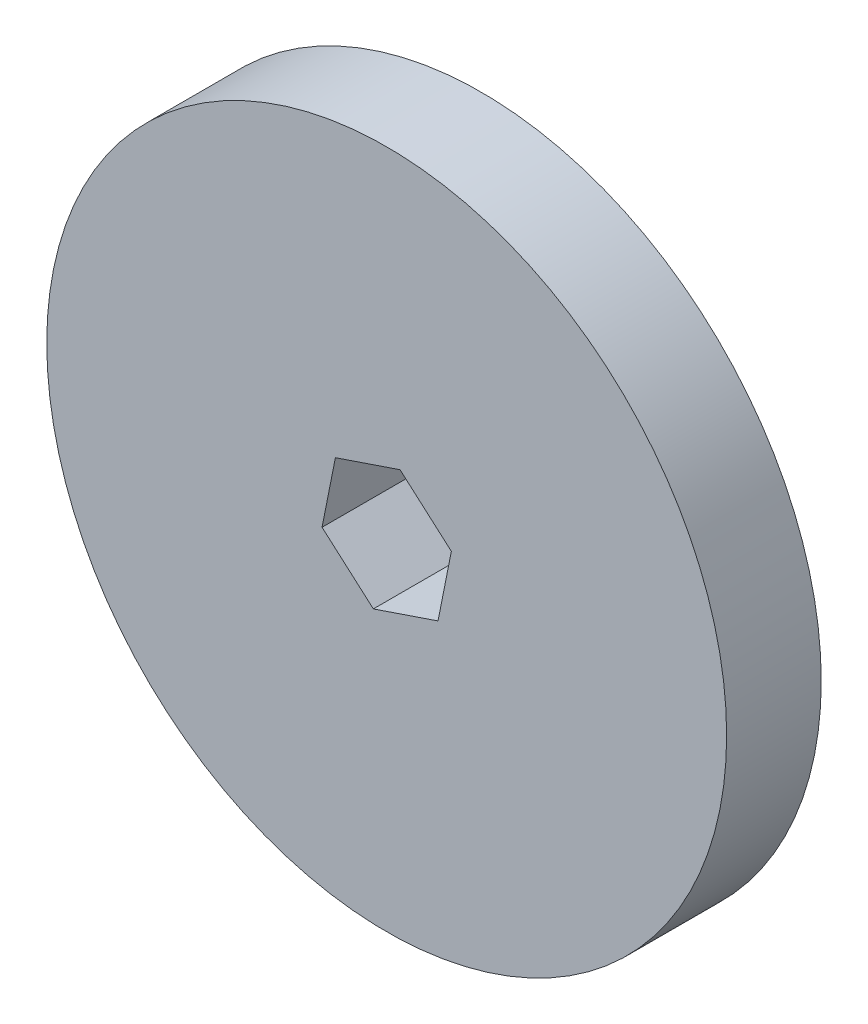
ISO-10303-21;
HEADER;
FILE_DESCRIPTION(('STEP AP214'),'2;1');
FILE_NAME('part.step','',(''),(''),'','','');
FILE_SCHEMA(('AUTOMOTIVE_DESIGN { 1 0 10303 214 1 1 1 1 }'));
ENDSEC;
DATA;
#1=APPLICATION_CONTEXT('core data for automotive mechanical design processes');
#2=APPLICATION_PROTOCOL_DEFINITION('international standard','automotive_design',2000,#1);
#3=PRODUCT_CONTEXT('',#1,'mechanical');
#4=PRODUCT('Part','Part','',(#3));
#5=PRODUCT_RELATED_PRODUCT_CATEGORY('part','',(#4));
#6=PRODUCT_DEFINITION_FORMATION('','',#4);
#7=PRODUCT_DEFINITION_CONTEXT('part definition',#1,'design');
#8=PRODUCT_DEFINITION('design','',#6,#7);
#9=PRODUCT_DEFINITION_SHAPE('','',#8);
#10=(LENGTH_UNIT() NAMED_UNIT(*) SI_UNIT(.MILLI.,.METRE.));
#11=(NAMED_UNIT(*) PLANE_ANGLE_UNIT() SI_UNIT($,.RADIAN.));
#12=(NAMED_UNIT(*) SI_UNIT($,.STERADIAN.) SOLID_ANGLE_UNIT());
#13=UNCERTAINTY_MEASURE_WITH_UNIT(LENGTH_MEASURE(1.E-05),#10,'distance_accuracy_value','');
#14=(GEOMETRIC_REPRESENTATION_CONTEXT(3) GLOBAL_UNCERTAINTY_ASSIGNED_CONTEXT((#13)) GLOBAL_UNIT_ASSIGNED_CONTEXT((#10,
#11,#12)) REPRESENTATION_CONTEXT('',''));
#15=CARTESIAN_POINT('',(0.,0.,0.));
#16=DIRECTION('',(0.,0.,1.));
#17=DIRECTION('',(1.,0.,0.));
#18=AXIS2_PLACEMENT_3D('',#15,#16,#17);
#19=CARTESIAN_POINT('',(0.,0.,10.16));
#20=DIRECTION('',(0.,0.,-1.));
#21=DIRECTION('',(-1.,0.,0.));
#22=AXIS2_PLACEMENT_3D('',#19,#20,#21);
#23=CYLINDRICAL_SURFACE('',#22,36.5125);
#24=CARTESIAN_POINT('',(0.,0.,10.16));
#25=DIRECTION('',(0.,0.,1.));
#26=DIRECTION('',(1.,0.,0.));
#27=AXIS2_PLACEMENT_3D('',#24,#25,#26);
#28=CIRCLE('',#27,36.5125);
#29=CARTESIAN_POINT('',(36.5125,0.,10.16));
#30=VERTEX_POINT('',#29);
#31=EDGE_CURVE('E11',#30,#30,#28,.T.);
#32=ORIENTED_EDGE('',*,*,#31,.F.);
#33=EDGE_LOOP('',(#32));
#34=FACE_BOUND('',#33,.T.);
#35=CARTESIAN_POINT('',(0.,0.,0.));
#36=DIRECTION('',(0.,0.,1.));
#37=DIRECTION('',(1.,0.,0.));
#38=AXIS2_PLACEMENT_3D('',#35,#36,#37);
#39=CIRCLE('',#38,36.5125);
#40=CARTESIAN_POINT('',(36.5125,0.,0.));
#41=VERTEX_POINT('',#40);
#42=EDGE_CURVE('E36',#41,#41,#39,.T.);
#43=ORIENTED_EDGE('',*,*,#42,.T.);
#44=EDGE_LOOP('',(#43));
#45=FACE_BOUND('',#44,.T.);
#46=ADVANCED_FACE('F33',(#34,#45),#23,.T.);
#47=CARTESIAN_POINT('',(0.,0.,10.16));
#48=DIRECTION('',(0.,0.,1.));
#49=DIRECTION('',(1.,0.,0.));
#50=AXIS2_PLACEMENT_3D('',#47,#48,#49);
#51=PLANE('',#50);
#52=DIRECTION('',(0.195502936143121,0.980703116115891,0.));
#53=VECTOR('',#52,1.);
#54=CARTESIAN_POINT('',(5.51071696499497,-4.83687211584611,10.16));
#55=LINE('',#54,#53);
#56=CARTESIAN_POINT('',(5.51071696499497,-4.83687211584611,10.16));
#57=VERTEX_POINT('',#56);
#58=CARTESIAN_POINT('',(6.94421260967681,2.35398482682847,10.16));
#59=VERTEX_POINT('',#58);
#60=EDGE_CURVE('E47',#57,#59,#55,.T.);
#61=ORIENTED_EDGE('',*,*,#60,.F.);
#62=DIRECTION('',(0.947065280198482,0.321041048843555,0.));
#63=VECTOR('',#62,1.);
#64=CARTESIAN_POINT('',(-1.43349564468183,-7.19085694267458,10.16));
#65=LINE('',#64,#63);
#66=CARTESIAN_POINT('',(-1.43349564468183,-7.19085694267458,10.16));
#67=VERTEX_POINT('',#66);
#68=EDGE_CURVE('E104',#67,#57,#65,.T.);
#69=ORIENTED_EDGE('',*,*,#68,.F.);
#70=DIRECTION('',(0.751562344055361,-0.659662067272335,0.));
#71=VECTOR('',#70,1.);
#72=CARTESIAN_POINT('',(-6.94421260967681,-2.35398482682847,10.16));
#73=LINE('',#72,#71);
#74=CARTESIAN_POINT('',(-6.94421260967681,-2.35398482682847,10.16));
#75=VERTEX_POINT('',#74);
#76=EDGE_CURVE('E107',#75,#67,#73,.T.);
#77=ORIENTED_EDGE('',*,*,#76,.F.);
#78=DIRECTION('',(-0.195502936143121,-0.980703116115891,0.));
#79=VECTOR('',#78,1.);
#80=CARTESIAN_POINT('',(-5.51071696499498,4.83687211584611,10.16));
#81=LINE('',#80,#79);
#82=CARTESIAN_POINT('',(-5.51071696499498,4.83687211584611,10.16));
#83=VERTEX_POINT('',#82);
#84=EDGE_CURVE('E123',#83,#75,#81,.T.);
#85=ORIENTED_EDGE('',*,*,#84,.F.);
#86=DIRECTION('',(-0.947065280198482,-0.321041048843555,0.));
#87=VECTOR('',#86,1.);
#88=CARTESIAN_POINT('',(1.43349564468183,7.19085694267458,10.16));
#89=LINE('',#88,#87);
#90=CARTESIAN_POINT('',(1.43349564468183,7.19085694267458,10.16));
#91=VERTEX_POINT('',#90);
#92=EDGE_CURVE('E120',#91,#83,#89,.T.);
#93=ORIENTED_EDGE('',*,*,#92,.F.);
#94=DIRECTION('',(-0.751562344055361,0.659662067272335,0.));
#95=VECTOR('',#94,1.);
#96=CARTESIAN_POINT('',(6.94421260967681,2.35398482682847,10.16));
#97=LINE('',#96,#95);
#98=EDGE_CURVE('E118',#59,#91,#97,.T.);
#99=ORIENTED_EDGE('',*,*,#98,.F.);
#100=EDGE_LOOP('',(#61,#69,#77,#85,#93,#99));
#101=FACE_BOUND('',#100,.T.);
#102=ORIENTED_EDGE('',*,*,#31,.T.);
#103=EDGE_LOOP('',(#102));
#104=FACE_BOUND('',#103,.T.);
#105=ADVANCED_FACE('F140',(#101,#104),#51,.T.);
#106=CARTESIAN_POINT('',(0.,0.,0.));
#107=DIRECTION('',(0.,0.,1.));
#108=DIRECTION('',(1.,0.,0.));
#109=AXIS2_PLACEMENT_3D('',#106,#107,#108);
#110=PLANE('',#109);
#111=DIRECTION('',(0.947065280198482,0.321041048843555,0.));
#112=VECTOR('',#111,1.);
#113=CARTESIAN_POINT('',(-1.43349564468183,-7.19085694267458,0.));
#114=LINE('',#113,#112);
#115=CARTESIAN_POINT('',(-1.43349564468183,-7.19085694267458,0.));
#116=VERTEX_POINT('',#115);
#117=CARTESIAN_POINT('',(5.51071696499497,-4.83687211584611,0.));
#118=VERTEX_POINT('',#117);
#119=EDGE_CURVE('E93',#116,#118,#114,.T.);
#120=ORIENTED_EDGE('',*,*,#119,.T.);
#121=DIRECTION('',(0.195502936143121,0.980703116115891,0.));
#122=VECTOR('',#121,1.);
#123=CARTESIAN_POINT('',(5.51071696499497,-4.83687211584611,0.));
#124=LINE('',#123,#122);
#125=CARTESIAN_POINT('',(6.94421260967681,2.35398482682847,0.));
#126=VERTEX_POINT('',#125);
#127=EDGE_CURVE('E87',#118,#126,#124,.T.);
#128=ORIENTED_EDGE('',*,*,#127,.T.);
#129=DIRECTION('',(-0.751562344055361,0.659662067272335,0.));
#130=VECTOR('',#129,1.);
#131=CARTESIAN_POINT('',(6.94421260967681,2.35398482682847,0.));
#132=LINE('',#131,#130);
#133=CARTESIAN_POINT('',(1.43349564468183,7.19085694267458,0.));
#134=VERTEX_POINT('',#133);
#135=EDGE_CURVE('E96',#126,#134,#132,.T.);
#136=ORIENTED_EDGE('',*,*,#135,.T.);
#137=DIRECTION('',(-0.947065280198482,-0.321041048843555,0.));
#138=VECTOR('',#137,1.);
#139=CARTESIAN_POINT('',(1.43349564468183,7.19085694267458,0.));
#140=LINE('',#139,#138);
#141=CARTESIAN_POINT('',(-5.51071696499498,4.83687211584611,0.));
#142=VERTEX_POINT('',#141);
#143=EDGE_CURVE('E55',#134,#142,#140,.T.);
#144=ORIENTED_EDGE('',*,*,#143,.T.);
#145=DIRECTION('',(-0.195502936143121,-0.980703116115891,0.));
#146=VECTOR('',#145,1.);
#147=CARTESIAN_POINT('',(-5.51071696499498,4.83687211584611,0.));
#148=LINE('',#147,#146);
#149=CARTESIAN_POINT('',(-6.94421260967681,-2.35398482682847,0.));
#150=VERTEX_POINT('',#149);
#151=EDGE_CURVE('E111',#142,#150,#148,.T.);
#152=ORIENTED_EDGE('',*,*,#151,.T.);
#153=DIRECTION('',(0.751562344055361,-0.659662067272335,0.));
#154=VECTOR('',#153,1.);
#155=CARTESIAN_POINT('',(-6.94421260967681,-2.35398482682847,0.));
#156=LINE('',#155,#154);
#157=EDGE_CURVE('E114',#150,#116,#156,.T.);
#158=ORIENTED_EDGE('',*,*,#157,.T.);
#159=EDGE_LOOP('',(#120,#128,#136,#144,#152,#158));
#160=FACE_BOUND('',#159,.T.);
#161=ORIENTED_EDGE('',*,*,#42,.F.);
#162=EDGE_LOOP('',(#161));
#163=FACE_BOUND('',#162,.T.);
#164=ADVANCED_FACE('F100',(#160,#163),#110,.F.);
#165=CARTESIAN_POINT('',(5.51071696499497,-4.83687211584611,0.));
#166=DIRECTION('',(0.980703116115891,-0.195502936143121,0.));
#167=DIRECTION('',(0.195502936143121,0.980703116115891,0.));
#168=AXIS2_PLACEMENT_3D('',#165,#166,#167);
#169=PLANE('',#168);
#170=ORIENTED_EDGE('',*,*,#60,.T.);
#171=DIRECTION('',(0.,0.,1.));
#172=VECTOR('',#171,1.);
#173=CARTESIAN_POINT('',(6.94421260967681,2.35398482682847,0.));
#174=LINE('',#173,#172);
#175=EDGE_CURVE('E83',#126,#59,#174,.T.);
#176=ORIENTED_EDGE('',*,*,#175,.F.);
#177=ORIENTED_EDGE('',*,*,#127,.F.);
#178=DIRECTION('',(0.,0.,1.));
#179=VECTOR('',#178,1.);
#180=CARTESIAN_POINT('',(5.51071696499497,-4.83687211584611,0.));
#181=LINE('',#180,#179);
#182=EDGE_CURVE('E128',#118,#57,#181,.T.);
#183=ORIENTED_EDGE('',*,*,#182,.T.);
#184=EDGE_LOOP('',(#170,#176,#177,#183));
#185=FACE_BOUND('',#184,.T.);
#186=ADVANCED_FACE('F85',(#185),#169,.F.);
#187=CARTESIAN_POINT('',(-1.43349564468183,-7.19085694267458,0.));
#188=DIRECTION('',(0.321041048843555,-0.947065280198482,0.));
#189=DIRECTION('',(0.947065280198482,0.321041048843555,0.));
#190=AXIS2_PLACEMENT_3D('',#187,#188,#189);
#191=PLANE('',#190);
#192=ORIENTED_EDGE('',*,*,#68,.T.);
#193=ORIENTED_EDGE('',*,*,#182,.F.);
#194=ORIENTED_EDGE('',*,*,#119,.F.);
#195=DIRECTION('',(0.,0.,1.));
#196=VECTOR('',#195,1.);
#197=CARTESIAN_POINT('',(-1.43349564468183,-7.19085694267458,0.));
#198=LINE('',#197,#196);
#199=EDGE_CURVE('E130',#116,#67,#198,.T.);
#200=ORIENTED_EDGE('',*,*,#199,.T.);
#201=EDGE_LOOP('',(#192,#193,#194,#200));
#202=FACE_BOUND('',#201,.T.);
#203=ADVANCED_FACE('F151',(#202),#191,.F.);
#204=CARTESIAN_POINT('',(-6.94421260967681,-2.35398482682847,0.));
#205=DIRECTION('',(-0.659662067272335,-0.751562344055361,0.));
#206=DIRECTION('',(0.751562344055361,-0.659662067272335,0.));
#207=AXIS2_PLACEMENT_3D('',#204,#205,#206);
#208=PLANE('',#207);
#209=ORIENTED_EDGE('',*,*,#76,.T.);
#210=ORIENTED_EDGE('',*,*,#199,.F.);
#211=ORIENTED_EDGE('',*,*,#157,.F.);
#212=DIRECTION('',(0.,0.,1.));
#213=VECTOR('',#212,1.);
#214=CARTESIAN_POINT('',(-6.94421260967681,-2.35398482682847,0.));
#215=LINE('',#214,#213);
#216=EDGE_CURVE('E132',#150,#75,#215,.T.);
#217=ORIENTED_EDGE('',*,*,#216,.T.);
#218=EDGE_LOOP('',(#209,#210,#211,#217));
#219=FACE_BOUND('',#218,.T.);
#220=ADVANCED_FACE('F149',(#219),#208,.F.);
#221=CARTESIAN_POINT('',(-5.51071696499498,4.83687211584611,0.));
#222=DIRECTION('',(-0.980703116115891,0.195502936143121,0.));
#223=DIRECTION('',(-0.195502936143121,-0.980703116115891,0.));
#224=AXIS2_PLACEMENT_3D('',#221,#222,#223);
#225=PLANE('',#224);
#226=ORIENTED_EDGE('',*,*,#84,.T.);
#227=ORIENTED_EDGE('',*,*,#216,.F.);
#228=ORIENTED_EDGE('',*,*,#151,.F.);
#229=DIRECTION('',(0.,0.,1.));
#230=VECTOR('',#229,1.);
#231=CARTESIAN_POINT('',(-5.51071696499498,4.83687211584611,0.));
#232=LINE('',#231,#230);
#233=EDGE_CURVE('E134',#142,#83,#232,.T.);
#234=ORIENTED_EDGE('',*,*,#233,.T.);
#235=EDGE_LOOP('',(#226,#227,#228,#234));
#236=FACE_BOUND('',#235,.T.);
#237=ADVANCED_FACE('F145',(#236),#225,.F.);
#238=CARTESIAN_POINT('',(1.43349564468183,7.19085694267458,0.));
#239=DIRECTION('',(-0.321041048843555,0.947065280198482,0.));
#240=DIRECTION('',(-0.947065280198482,-0.321041048843555,0.));
#241=AXIS2_PLACEMENT_3D('',#238,#239,#240);
#242=PLANE('',#241);
#243=ORIENTED_EDGE('',*,*,#92,.T.);
#244=ORIENTED_EDGE('',*,*,#233,.F.);
#245=ORIENTED_EDGE('',*,*,#143,.F.);
#246=DIRECTION('',(0.,0.,1.));
#247=VECTOR('',#246,1.);
#248=CARTESIAN_POINT('',(1.43349564468183,7.19085694267458,0.));
#249=LINE('',#248,#247);
#250=EDGE_CURVE('E92',#134,#91,#249,.T.);
#251=ORIENTED_EDGE('',*,*,#250,.T.);
#252=EDGE_LOOP('',(#243,#244,#245,#251));
#253=FACE_BOUND('',#252,.T.);
#254=ADVANCED_FACE('F136',(#253),#242,.F.);
#255=CARTESIAN_POINT('',(6.94421260967681,2.35398482682847,0.));
#256=DIRECTION('',(0.659662067272335,0.751562344055361,0.));
#257=DIRECTION('',(-0.751562344055361,0.659662067272335,0.));
#258=AXIS2_PLACEMENT_3D('',#255,#256,#257);
#259=PLANE('',#258);
#260=ORIENTED_EDGE('',*,*,#98,.T.);
#261=ORIENTED_EDGE('',*,*,#250,.F.);
#262=ORIENTED_EDGE('',*,*,#135,.F.);
#263=ORIENTED_EDGE('',*,*,#175,.T.);
#264=EDGE_LOOP('',(#260,#261,#262,#263));
#265=FACE_BOUND('',#264,.T.);
#266=ADVANCED_FACE('F97',(#265),#259,.F.);
#267=CLOSED_SHELL('',(#46,#105,#164,#186,#203,#220,#237,#254,#266));
#268=MANIFOLD_SOLID_BREP('B2',#267);
#269=ADVANCED_BREP_SHAPE_REPRESENTATION('',(#18,#268),#14);
#270=SHAPE_DEFINITION_REPRESENTATION(#9,#269);
ENDSEC;
END-ISO-10303-21;
